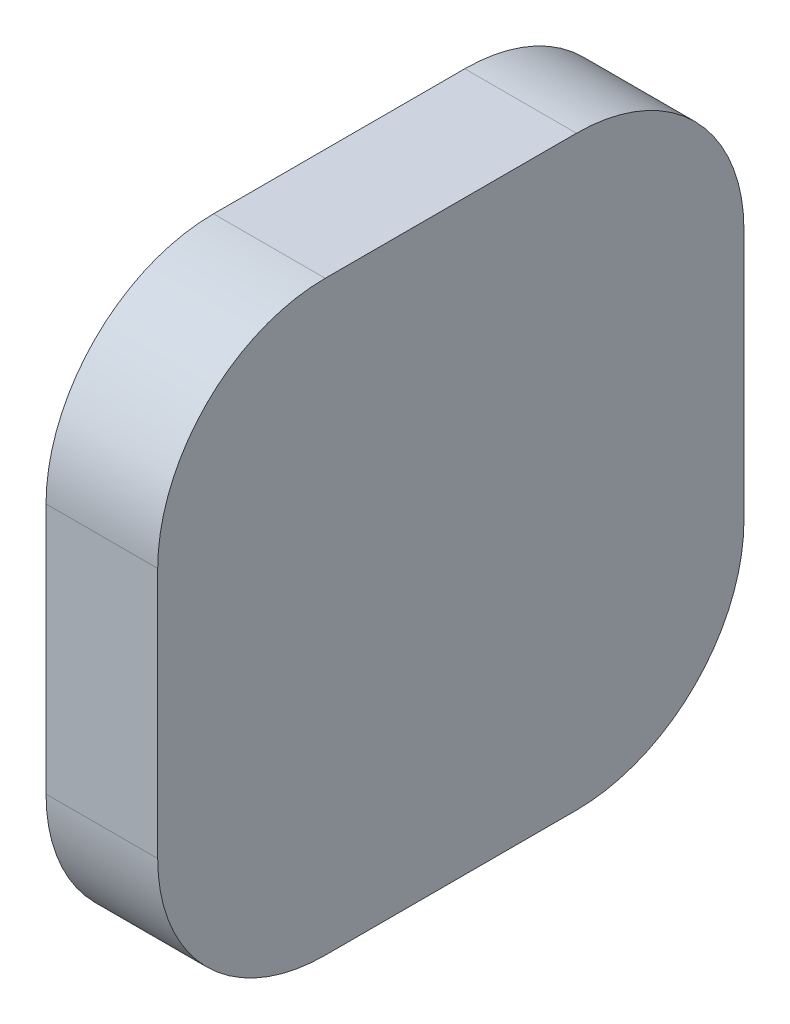
ISO-10303-21;
HEADER;
FILE_DESCRIPTION(('STEP AP214'),'2;1');
FILE_NAME('part.step','',(''),(''),'','','');
FILE_SCHEMA(('AUTOMOTIVE_DESIGN { 1 0 10303 214 1 1 1 1 }'));
ENDSEC;
DATA;
#1=APPLICATION_CONTEXT('core data for automotive mechanical design processes');
#2=APPLICATION_PROTOCOL_DEFINITION('international standard','automotive_design',2000,#1);
#3=PRODUCT_CONTEXT('',#1,'mechanical');
#4=PRODUCT('Part','Part','',(#3));
#5=PRODUCT_RELATED_PRODUCT_CATEGORY('part','',(#4));
#6=PRODUCT_DEFINITION_FORMATION('','',#4);
#7=PRODUCT_DEFINITION_CONTEXT('part definition',#1,'design');
#8=PRODUCT_DEFINITION('design','',#6,#7);
#9=PRODUCT_DEFINITION_SHAPE('','',#8);
#10=(LENGTH_UNIT() NAMED_UNIT(*) SI_UNIT(.MILLI.,.METRE.));
#11=(NAMED_UNIT(*) PLANE_ANGLE_UNIT() SI_UNIT($,.RADIAN.));
#12=(NAMED_UNIT(*) SI_UNIT($,.STERADIAN.) SOLID_ANGLE_UNIT());
#13=UNCERTAINTY_MEASURE_WITH_UNIT(LENGTH_MEASURE(1.E-05),#10,'distance_accuracy_value','');
#14=(GEOMETRIC_REPRESENTATION_CONTEXT(3) GLOBAL_UNCERTAINTY_ASSIGNED_CONTEXT((#13)) GLOBAL_UNIT_ASSIGNED_CONTEXT((#10,
#11,#12)) REPRESENTATION_CONTEXT('',''));
#15=CARTESIAN_POINT('',(0.,0.,0.));
#16=DIRECTION('',(0.,0.,1.));
#17=DIRECTION('',(1.,0.,0.));
#18=AXIS2_PLACEMENT_3D('',#15,#16,#17);
#19=CARTESIAN_POINT('',(-2.7,24.4363773254857,-0.900000000000003));
#20=DIRECTION('',(-1.,0.,0.));
#21=DIRECTION('',(0.,0.,1.));
#22=AXIS2_PLACEMENT_3D('',#19,#20,#21);
#23=CYLINDRICAL_SURFACE('',#22,1.2);
#24=CARTESIAN_POINT('',(-3.5,24.4363773254857,-0.900000000000003));
#25=DIRECTION('',(1.,0.,0.));
#26=DIRECTION('',(0.,0.,1.));
#27=AXIS2_PLACEMENT_3D('',#24,#25,#26);
#28=CIRCLE('',#27,1.2);
#29=CARTESIAN_POINT('',(-3.5,23.2363773254857,-0.899999999999994));
#30=VERTEX_POINT('',#29);
#31=CARTESIAN_POINT('',(-3.5,24.4363773254857,-2.1));
#32=VERTEX_POINT('',#31);
#33=EDGE_CURVE('E131',#30,#32,#28,.T.);
#34=ORIENTED_EDGE('',*,*,#33,.T.);
#35=DIRECTION('',(-1.,0.,0.));
#36=VECTOR('',#35,1.);
#37=CARTESIAN_POINT('',(-2.7,24.4363773254857,-2.1));
#38=LINE('',#37,#36);
#39=CARTESIAN_POINT('',(-2.7,24.4363773254857,-2.1));
#40=VERTEX_POINT('',#39);
#41=EDGE_CURVE('E11',#40,#32,#38,.T.);
#42=ORIENTED_EDGE('',*,*,#41,.F.);
#43=CARTESIAN_POINT('',(-2.7,24.4363773254857,-0.900000000000003));
#44=DIRECTION('',(1.,0.,0.));
#45=DIRECTION('',(0.,0.,1.));
#46=AXIS2_PLACEMENT_3D('',#43,#44,#45);
#47=CIRCLE('',#46,1.2);
#48=CARTESIAN_POINT('',(-2.7,23.2363773254857,-0.899999999999994));
#49=VERTEX_POINT('',#48);
#50=EDGE_CURVE('E145',#49,#40,#47,.T.);
#51=ORIENTED_EDGE('',*,*,#50,.F.);
#52=DIRECTION('',(-1.,0.,0.));
#53=VECTOR('',#52,1.);
#54=CARTESIAN_POINT('',(-2.7,23.2363773254857,-0.899999999999994));
#55=LINE('',#54,#53);
#56=EDGE_CURVE('E127',#49,#30,#55,.T.);
#57=ORIENTED_EDGE('',*,*,#56,.T.);
#58=EDGE_LOOP('',(#34,#42,#51,#57));
#59=FACE_BOUND('',#58,.T.);
#60=ADVANCED_FACE('F35',(#59),#23,.T.);
#61=CARTESIAN_POINT('',(-2.7,26.2363773254857,-2.1));
#62=DIRECTION('',(0.,0.,1.));
#63=DIRECTION('',(0.,-1.,0.));
#64=AXIS2_PLACEMENT_3D('',#61,#62,#63);
#65=PLANE('',#64);
#66=DIRECTION('',(0.,1.,0.));
#67=VECTOR('',#66,1.);
#68=CARTESIAN_POINT('',(-3.5,26.2363773254857,-2.1));
#69=LINE('',#68,#67);
#70=CARTESIAN_POINT('',(-3.5,26.2363773254857,-2.1));
#71=VERTEX_POINT('',#70);
#72=EDGE_CURVE('E134',#32,#71,#69,.T.);
#73=ORIENTED_EDGE('',*,*,#72,.T.);
#74=DIRECTION('',(-1.,0.,0.));
#75=VECTOR('',#74,1.);
#76=CARTESIAN_POINT('',(-2.7,26.2363773254857,-2.1));
#77=LINE('',#76,#75);
#78=CARTESIAN_POINT('',(-2.7,26.2363773254857,-2.1));
#79=VERTEX_POINT('',#78);
#80=EDGE_CURVE('E43',#79,#71,#77,.T.);
#81=ORIENTED_EDGE('',*,*,#80,.F.);
#82=DIRECTION('',(0.,1.,0.));
#83=VECTOR('',#82,1.);
#84=CARTESIAN_POINT('',(-2.7,26.2363773254857,-2.1));
#85=LINE('',#84,#83);
#86=EDGE_CURVE('E94',#40,#79,#85,.T.);
#87=ORIENTED_EDGE('',*,*,#86,.F.);
#88=ORIENTED_EDGE('',*,*,#41,.T.);
#89=EDGE_LOOP('',(#73,#81,#87,#88));
#90=FACE_BOUND('',#89,.T.);
#91=ADVANCED_FACE('F180',(#90),#65,.F.);
#92=CARTESIAN_POINT('',(-2.7,26.2363773254857,-0.900000000000002));
#93=DIRECTION('',(-1.,0.,0.));
#94=DIRECTION('',(0.,0.,1.));
#95=AXIS2_PLACEMENT_3D('',#92,#93,#94);
#96=CYLINDRICAL_SURFACE('',#95,1.2);
#97=CARTESIAN_POINT('',(-3.5,26.2363773254857,-0.900000000000002));
#98=DIRECTION('',(1.,0.,0.));
#99=DIRECTION('',(0.,0.,1.));
#100=AXIS2_PLACEMENT_3D('',#97,#98,#99);
#101=CIRCLE('',#100,1.2);
#102=CARTESIAN_POINT('',(-3.5,27.4363773254857,-0.899999999999994));
#103=VERTEX_POINT('',#102);
#104=EDGE_CURVE('E136',#71,#103,#101,.T.);
#105=ORIENTED_EDGE('',*,*,#104,.T.);
#106=DIRECTION('',(-1.,0.,0.));
#107=VECTOR('',#106,1.);
#108=CARTESIAN_POINT('',(-2.7,27.4363773254857,-0.899999999999994));
#109=LINE('',#108,#107);
#110=CARTESIAN_POINT('',(-2.7,27.4363773254857,-0.899999999999994));
#111=VERTEX_POINT('',#110);
#112=EDGE_CURVE('E152',#111,#103,#109,.T.);
#113=ORIENTED_EDGE('',*,*,#112,.F.);
#114=CARTESIAN_POINT('',(-2.7,26.2363773254857,-0.900000000000002));
#115=DIRECTION('',(1.,0.,0.));
#116=DIRECTION('',(0.,0.,1.));
#117=AXIS2_PLACEMENT_3D('',#114,#115,#116);
#118=CIRCLE('',#117,1.2);
#119=EDGE_CURVE('E160',#79,#111,#118,.T.);
#120=ORIENTED_EDGE('',*,*,#119,.F.);
#121=ORIENTED_EDGE('',*,*,#80,.T.);
#122=EDGE_LOOP('',(#105,#113,#120,#121));
#123=FACE_BOUND('',#122,.T.);
#124=ADVANCED_FACE('F158',(#123),#96,.T.);
#125=CARTESIAN_POINT('',(-2.7,27.4363773254857,-0.899999999999994));
#126=DIRECTION('',(0.,-1.,0.));
#127=DIRECTION('',(0.,0.,-1.));
#128=AXIS2_PLACEMENT_3D('',#125,#126,#127);
#129=PLANE('',#128);
#130=DIRECTION('',(0.,0.,1.));
#131=VECTOR('',#130,1.);
#132=CARTESIAN_POINT('',(-3.5,27.4363773254857,-0.899999999999994));
#133=LINE('',#132,#131);
#134=CARTESIAN_POINT('',(-3.5,27.4363773254857,0.89999999999999));
#135=VERTEX_POINT('',#134);
#136=EDGE_CURVE('E138',#103,#135,#133,.T.);
#137=ORIENTED_EDGE('',*,*,#136,.T.);
#138=DIRECTION('',(-1.,0.,0.));
#139=VECTOR('',#138,1.);
#140=CARTESIAN_POINT('',(-2.7,27.4363773254857,0.89999999999999));
#141=LINE('',#140,#139);
#142=CARTESIAN_POINT('',(-2.7,27.4363773254857,0.89999999999999));
#143=VERTEX_POINT('',#142);
#144=EDGE_CURVE('E149',#143,#135,#141,.T.);
#145=ORIENTED_EDGE('',*,*,#144,.F.);
#146=DIRECTION('',(0.,0.,1.));
#147=VECTOR('',#146,1.);
#148=CARTESIAN_POINT('',(-2.7,27.4363773254857,-0.899999999999994));
#149=LINE('',#148,#147);
#150=EDGE_CURVE('E172',#111,#143,#149,.T.);
#151=ORIENTED_EDGE('',*,*,#150,.F.);
#152=ORIENTED_EDGE('',*,*,#112,.T.);
#153=EDGE_LOOP('',(#137,#145,#151,#152));
#154=FACE_BOUND('',#153,.T.);
#155=ADVANCED_FACE('F168',(#154),#129,.F.);
#156=CARTESIAN_POINT('',(-2.7,26.2363773254857,0.899999999999998));
#157=DIRECTION('',(-1.,0.,0.));
#158=DIRECTION('',(0.,0.,1.));
#159=AXIS2_PLACEMENT_3D('',#156,#157,#158);
#160=CYLINDRICAL_SURFACE('',#159,1.2);
#161=CARTESIAN_POINT('',(-3.5,26.2363773254857,0.899999999999998));
#162=DIRECTION('',(1.,0.,0.));
#163=DIRECTION('',(0.,0.,-1.));
#164=AXIS2_PLACEMENT_3D('',#161,#162,#163);
#165=CIRCLE('',#164,1.2);
#166=CARTESIAN_POINT('',(-3.5,26.2363773254857,2.1));
#167=VERTEX_POINT('',#166);
#168=EDGE_CURVE('E140',#135,#167,#165,.T.);
#169=ORIENTED_EDGE('',*,*,#168,.T.);
#170=DIRECTION('',(-1.,0.,0.));
#171=VECTOR('',#170,1.);
#172=CARTESIAN_POINT('',(-2.7,26.2363773254857,2.1));
#173=LINE('',#172,#171);
#174=CARTESIAN_POINT('',(-2.7,26.2363773254857,2.1));
#175=VERTEX_POINT('',#174);
#176=EDGE_CURVE('E122',#175,#167,#173,.T.);
#177=ORIENTED_EDGE('',*,*,#176,.F.);
#178=CARTESIAN_POINT('',(-2.7,26.2363773254857,0.899999999999998));
#179=DIRECTION('',(1.,0.,0.));
#180=DIRECTION('',(0.,0.,-1.));
#181=AXIS2_PLACEMENT_3D('',#178,#179,#180);
#182=CIRCLE('',#181,1.2);
#183=EDGE_CURVE('E113',#143,#175,#182,.T.);
#184=ORIENTED_EDGE('',*,*,#183,.F.);
#185=ORIENTED_EDGE('',*,*,#144,.T.);
#186=EDGE_LOOP('',(#169,#177,#184,#185));
#187=FACE_BOUND('',#186,.T.);
#188=ADVANCED_FACE('F171',(#187),#160,.T.);
#189=CARTESIAN_POINT('',(-2.7,26.2363773254857,2.1));
#190=DIRECTION('',(0.,0.,-1.));
#191=DIRECTION('',(-1.,0.,0.));
#192=AXIS2_PLACEMENT_3D('',#189,#190,#191);
#193=PLANE('',#192);
#194=DIRECTION('',(0.,-1.,0.));
#195=VECTOR('',#194,1.);
#196=CARTESIAN_POINT('',(-3.5,26.2363773254857,2.1));
#197=LINE('',#196,#195);
#198=CARTESIAN_POINT('',(-3.5,24.4363773254857,2.1));
#199=VERTEX_POINT('',#198);
#200=EDGE_CURVE('E121',#167,#199,#197,.T.);
#201=ORIENTED_EDGE('',*,*,#200,.T.);
#202=DIRECTION('',(-1.,0.,0.));
#203=VECTOR('',#202,1.);
#204=CARTESIAN_POINT('',(-2.7,24.4363773254857,2.1));
#205=LINE('',#204,#203);
#206=CARTESIAN_POINT('',(-2.7,24.4363773254857,2.1));
#207=VERTEX_POINT('',#206);
#208=EDGE_CURVE('E118',#207,#199,#205,.T.);
#209=ORIENTED_EDGE('',*,*,#208,.F.);
#210=DIRECTION('',(0.,-1.,0.));
#211=VECTOR('',#210,1.);
#212=CARTESIAN_POINT('',(-2.7,26.2363773254857,2.1));
#213=LINE('',#212,#211);
#214=EDGE_CURVE('E107',#175,#207,#213,.T.);
#215=ORIENTED_EDGE('',*,*,#214,.F.);
#216=ORIENTED_EDGE('',*,*,#176,.T.);
#217=EDGE_LOOP('',(#201,#209,#215,#216));
#218=FACE_BOUND('',#217,.T.);
#219=ADVANCED_FACE('F119',(#218),#193,.F.);
#220=CARTESIAN_POINT('',(-2.7,24.4363773254857,0.899999999999998));
#221=DIRECTION('',(-1.,0.,0.));
#222=DIRECTION('',(0.,0.,1.));
#223=AXIS2_PLACEMENT_3D('',#220,#221,#222);
#224=CYLINDRICAL_SURFACE('',#223,1.2);
#225=CARTESIAN_POINT('',(-3.5,24.4363773254857,0.899999999999998));
#226=DIRECTION('',(1.,0.,0.));
#227=DIRECTION('',(0.,0.,1.));
#228=AXIS2_PLACEMENT_3D('',#225,#226,#227);
#229=CIRCLE('',#228,1.2);
#230=CARTESIAN_POINT('',(-3.5,23.2363773254857,0.899999999999989));
#231=VERTEX_POINT('',#230);
#232=EDGE_CURVE('E80',#199,#231,#229,.T.);
#233=ORIENTED_EDGE('',*,*,#232,.T.);
#234=DIRECTION('',(-1.,0.,0.));
#235=VECTOR('',#234,1.);
#236=CARTESIAN_POINT('',(-2.7,23.2363773254857,0.899999999999989));
#237=LINE('',#236,#235);
#238=CARTESIAN_POINT('',(-2.7,23.2363773254857,0.899999999999989));
#239=VERTEX_POINT('',#238);
#240=EDGE_CURVE('E123',#239,#231,#237,.T.);
#241=ORIENTED_EDGE('',*,*,#240,.F.);
#242=CARTESIAN_POINT('',(-2.7,24.4363773254857,0.899999999999998));
#243=DIRECTION('',(1.,0.,0.));
#244=DIRECTION('',(0.,0.,1.));
#245=AXIS2_PLACEMENT_3D('',#242,#243,#244);
#246=CIRCLE('',#245,1.2);
#247=EDGE_CURVE('E111',#207,#239,#246,.T.);
#248=ORIENTED_EDGE('',*,*,#247,.F.);
#249=ORIENTED_EDGE('',*,*,#208,.T.);
#250=EDGE_LOOP('',(#233,#241,#248,#249));
#251=FACE_BOUND('',#250,.T.);
#252=ADVANCED_FACE('F125',(#251),#224,.T.);
#253=CARTESIAN_POINT('',(-2.7,23.2363773254857,-0.899999999999994));
#254=DIRECTION('',(0.,1.,0.));
#255=DIRECTION('',(0.,0.,1.));
#256=AXIS2_PLACEMENT_3D('',#253,#254,#255);
#257=PLANE('',#256);
#258=DIRECTION('',(0.,0.,-1.));
#259=VECTOR('',#258,1.);
#260=CARTESIAN_POINT('',(-3.5,23.2363773254857,-0.899999999999994));
#261=LINE('',#260,#259);
#262=EDGE_CURVE('E86',#231,#30,#261,.T.);
#263=ORIENTED_EDGE('',*,*,#262,.T.);
#264=ORIENTED_EDGE('',*,*,#56,.F.);
#265=DIRECTION('',(0.,0.,-1.));
#266=VECTOR('',#265,1.);
#267=CARTESIAN_POINT('',(-2.7,23.2363773254857,-0.899999999999994));
#268=LINE('',#267,#266);
#269=EDGE_CURVE('E51',#239,#49,#268,.T.);
#270=ORIENTED_EDGE('',*,*,#269,.F.);
#271=ORIENTED_EDGE('',*,*,#240,.T.);
#272=EDGE_LOOP('',(#263,#264,#270,#271));
#273=FACE_BOUND('',#272,.T.);
#274=ADVANCED_FACE('F196',(#273),#257,.F.);
#275=CARTESIAN_POINT('',(-2.7,24.4363773254857,-0.900000000000003));
#276=DIRECTION('',(-1.,0.,0.));
#277=DIRECTION('',(0.,0.,1.));
#278=AXIS2_PLACEMENT_3D('',#275,#276,#277);
#279=PLANE('',#278);
#280=ORIENTED_EDGE('',*,*,#50,.T.);
#281=ORIENTED_EDGE('',*,*,#86,.T.);
#282=ORIENTED_EDGE('',*,*,#119,.T.);
#283=ORIENTED_EDGE('',*,*,#150,.T.);
#284=ORIENTED_EDGE('',*,*,#183,.T.);
#285=ORIENTED_EDGE('',*,*,#214,.T.);
#286=ORIENTED_EDGE('',*,*,#247,.T.);
#287=ORIENTED_EDGE('',*,*,#269,.T.);
#288=EDGE_LOOP('',(#280,#281,#282,#283,#284,#285,#286,#287));
#289=FACE_BOUND('',#288,.T.);
#290=ADVANCED_FACE('F109',(#289),#279,.F.);
#291=CARTESIAN_POINT('',(-3.5,24.4363773254857,-0.900000000000003));
#292=DIRECTION('',(-1.,0.,0.));
#293=DIRECTION('',(0.,0.,1.));
#294=AXIS2_PLACEMENT_3D('',#291,#292,#293);
#295=PLANE('',#294);
#296=ORIENTED_EDGE('',*,*,#33,.F.);
#297=ORIENTED_EDGE('',*,*,#262,.F.);
#298=ORIENTED_EDGE('',*,*,#232,.F.);
#299=ORIENTED_EDGE('',*,*,#200,.F.);
#300=ORIENTED_EDGE('',*,*,#168,.F.);
#301=ORIENTED_EDGE('',*,*,#136,.F.);
#302=ORIENTED_EDGE('',*,*,#104,.F.);
#303=ORIENTED_EDGE('',*,*,#72,.F.);
#304=EDGE_LOOP('',(#296,#297,#298,#299,#300,#301,#302,#303));
#305=FACE_BOUND('',#304,.T.);
#306=ADVANCED_FACE('F164',(#305),#295,.T.);
#307=CLOSED_SHELL('',(#60,#91,#124,#155,#188,#219,#252,#274,#290,#306));
#308=MANIFOLD_SOLID_BREP('B2',#307);
#309=ADVANCED_BREP_SHAPE_REPRESENTATION('',(#18,#308),#14);
#310=SHAPE_DEFINITION_REPRESENTATION(#9,#309);
ENDSEC;
END-ISO-10303-21;
